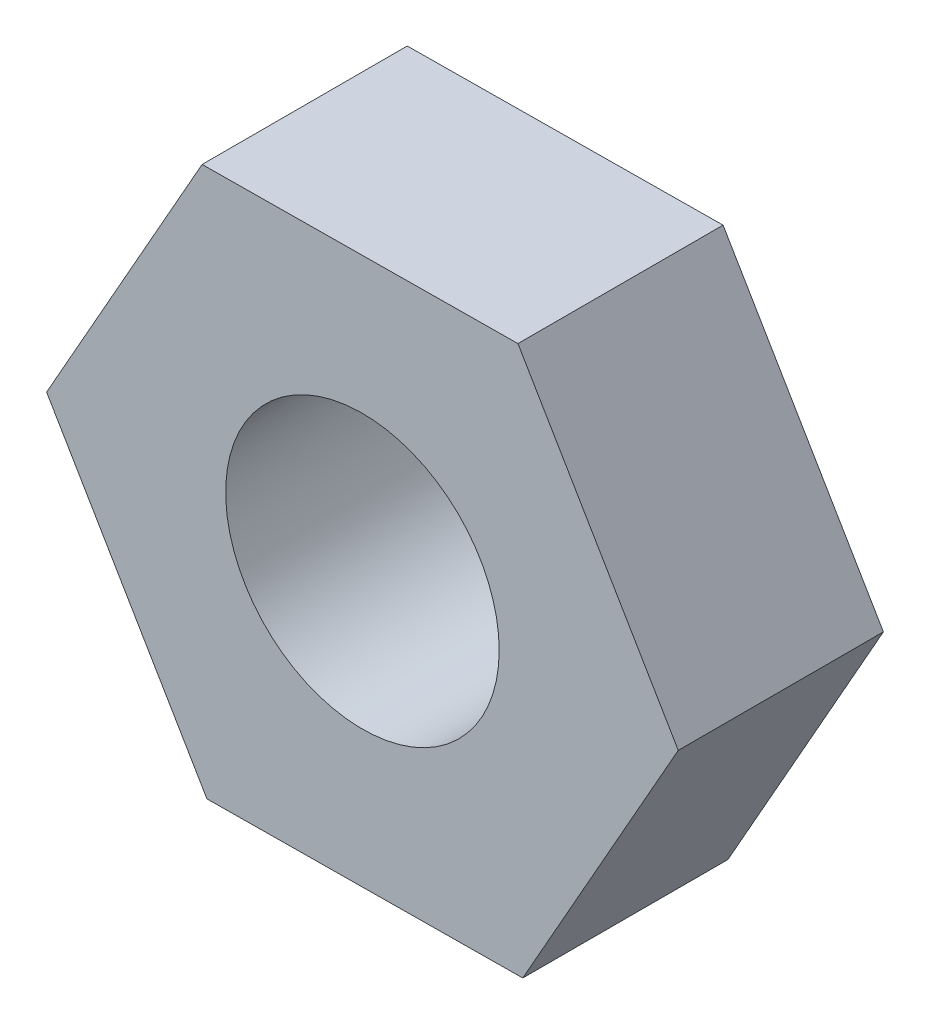
ISO-10303-21;
HEADER;
FILE_DESCRIPTION(('STEP AP214'),'2;1');
FILE_NAME('part.step','',(''),(''),'','','');
FILE_SCHEMA(('AUTOMOTIVE_DESIGN { 1 0 10303 214 1 1 1 1 }'));
ENDSEC;
DATA;
#1=APPLICATION_CONTEXT('core data for automotive mechanical design processes');
#2=APPLICATION_PROTOCOL_DEFINITION('international standard','automotive_design',2000,#1);
#3=PRODUCT_CONTEXT('',#1,'mechanical');
#4=PRODUCT('Part','Part','',(#3));
#5=PRODUCT_RELATED_PRODUCT_CATEGORY('part','',(#4));
#6=PRODUCT_DEFINITION_FORMATION('','',#4);
#7=PRODUCT_DEFINITION_CONTEXT('part definition',#1,'design');
#8=PRODUCT_DEFINITION('design','',#6,#7);
#9=PRODUCT_DEFINITION_SHAPE('','',#8);
#10=(LENGTH_UNIT() NAMED_UNIT(*) SI_UNIT(.MILLI.,.METRE.));
#11=(NAMED_UNIT(*) PLANE_ANGLE_UNIT() SI_UNIT($,.RADIAN.));
#12=(NAMED_UNIT(*) SI_UNIT($,.STERADIAN.) SOLID_ANGLE_UNIT());
#13=UNCERTAINTY_MEASURE_WITH_UNIT(LENGTH_MEASURE(1.E-05),#10,'distance_accuracy_value','');
#14=(GEOMETRIC_REPRESENTATION_CONTEXT(3) GLOBAL_UNCERTAINTY_ASSIGNED_CONTEXT((#13)) GLOBAL_UNIT_ASSIGNED_CONTEXT((#10,
#11,#12)) REPRESENTATION_CONTEXT('',''));
#15=CARTESIAN_POINT('',(0.,0.,0.));
#16=DIRECTION('',(0.,0.,1.));
#17=DIRECTION('',(1.,0.,0.));
#18=AXIS2_PLACEMENT_3D('',#15,#16,#17);
#19=CARTESIAN_POINT('',(0.,0.,1.5));
#20=DIRECTION('',(0.,0.,1.));
#21=DIRECTION('',(1.,0.,0.));
#22=AXIS2_PLACEMENT_3D('',#19,#20,#21);
#23=PLANE('',#22);
#24=DIRECTION('',(0.999961257640527,0.00880245522430745,0.));
#25=VECTOR('',#24,1.);
#26=CARTESIAN_POINT('',(-1.13705089210729,-2.01008671506762,1.5));
#27=LINE('',#26,#25);
#28=CARTESIAN_POINT('',(-1.13705089210729,-2.01008671506762,1.5));
#29=VERTEX_POINT('',#28);
#30=CARTESIAN_POINT('',(1.17226071300452,-1.98975831549449,1.5));
#31=VERTEX_POINT('',#30);
#32=EDGE_CURVE('E146',#29,#31,#27,.T.);
#33=ORIENTED_EDGE('',*,*,#32,.T.);
#34=DIRECTION('',(0.492357478980338,0.870393079529086,0.));
#35=VECTOR('',#34,1.);
#36=CARTESIAN_POINT('',(1.17226071300452,-1.98975831549449,1.5));
#37=LINE('',#36,#35);
#38=CARTESIAN_POINT('',(2.30931160511182,0.0203283995731343,1.5));
#39=VERTEX_POINT('',#38);
#40=EDGE_CURVE('E94',#31,#39,#37,.T.);
#41=ORIENTED_EDGE('',*,*,#40,.T.);
#42=DIRECTION('',(-0.507603778660189,0.861590624304779,0.));
#43=VECTOR('',#42,1.);
#44=CARTESIAN_POINT('',(2.30931160511182,0.0203283995731343,1.5));
#45=LINE('',#44,#43);
#46=CARTESIAN_POINT('',(1.13705089210729,2.01008671506762,1.5));
#47=VERTEX_POINT('',#46);
#48=EDGE_CURVE('E107',#39,#47,#45,.T.);
#49=ORIENTED_EDGE('',*,*,#48,.T.);
#50=DIRECTION('',(-0.999961257640527,-0.00880245522430745,0.));
#51=VECTOR('',#50,1.);
#52=CARTESIAN_POINT('',(1.13705089210729,2.01008671506762,1.5));
#53=LINE('',#52,#51);
#54=CARTESIAN_POINT('',(-1.17226071300452,1.98975831549449,1.5));
#55=VERTEX_POINT('',#54);
#56=EDGE_CURVE('E101',#47,#55,#53,.T.);
#57=ORIENTED_EDGE('',*,*,#56,.T.);
#58=DIRECTION('',(-0.492357478980338,-0.870393079529086,0.));
#59=VECTOR('',#58,1.);
#60=CARTESIAN_POINT('',(-1.17226071300452,1.98975831549449,1.5));
#61=LINE('',#60,#59);
#62=CARTESIAN_POINT('',(-2.30931160511182,-0.0203283995731342,1.5));
#63=VERTEX_POINT('',#62);
#64=EDGE_CURVE('E105',#55,#63,#61,.T.);
#65=ORIENTED_EDGE('',*,*,#64,.T.);
#66=DIRECTION('',(0.507603778660189,-0.861590624304779,0.));
#67=VECTOR('',#66,1.);
#68=CARTESIAN_POINT('',(-2.30931160511182,-0.0203283995731342,1.5));
#69=LINE('',#68,#67);
#70=EDGE_CURVE('E57',#63,#29,#69,.T.);
#71=ORIENTED_EDGE('',*,*,#70,.T.);
#72=EDGE_LOOP('',(#33,#41,#49,#57,#65,#71));
#73=FACE_BOUND('',#72,.T.);
#74=CARTESIAN_POINT('',(0.,0.,1.5));
#75=DIRECTION('',(0.,0.,1.));
#76=DIRECTION('',(1.,0.,0.));
#77=AXIS2_PLACEMENT_3D('',#74,#75,#76);
#78=CIRCLE('',#77,1.);
#79=CARTESIAN_POINT('',(1.,0.,1.5));
#80=VERTEX_POINT('',#79);
#81=EDGE_CURVE('E134',#80,#80,#78,.T.);
#82=ORIENTED_EDGE('',*,*,#81,.F.);
#83=EDGE_LOOP('',(#82));
#84=FACE_BOUND('',#83,.T.);
#85=ADVANCED_FACE('F39',(#73,#84),#23,.T.);
#86=CARTESIAN_POINT('',(0.,0.,0.));
#87=DIRECTION('',(0.,0.,1.));
#88=DIRECTION('',(1.,0.,0.));
#89=AXIS2_PLACEMENT_3D('',#86,#87,#88);
#90=PLANE('',#89);
#91=DIRECTION('',(0.999961257640527,0.00880245522430745,0.));
#92=VECTOR('',#91,1.);
#93=CARTESIAN_POINT('',(-1.13705089210729,-2.01008671506762,0.));
#94=LINE('',#93,#92);
#95=CARTESIAN_POINT('',(-1.13705089210729,-2.01008671506762,0.));
#96=VERTEX_POINT('',#95);
#97=CARTESIAN_POINT('',(1.17226071300452,-1.98975831549449,0.));
#98=VERTEX_POINT('',#97);
#99=EDGE_CURVE('E129',#96,#98,#94,.T.);
#100=ORIENTED_EDGE('',*,*,#99,.F.);
#101=DIRECTION('',(0.507603778660189,-0.861590624304779,0.));
#102=VECTOR('',#101,1.);
#103=CARTESIAN_POINT('',(-2.30931160511182,-0.0203283995731342,0.));
#104=LINE('',#103,#102);
#105=CARTESIAN_POINT('',(-2.30931160511182,-0.0203283995731342,0.));
#106=VERTEX_POINT('',#105);
#107=EDGE_CURVE('E86',#106,#96,#104,.T.);
#108=ORIENTED_EDGE('',*,*,#107,.F.);
#109=DIRECTION('',(-0.492357478980338,-0.870393079529086,0.));
#110=VECTOR('',#109,1.);
#111=CARTESIAN_POINT('',(-1.17226071300452,1.98975831549449,0.));
#112=LINE('',#111,#110);
#113=CARTESIAN_POINT('',(-1.17226071300452,1.98975831549449,0.));
#114=VERTEX_POINT('',#113);
#115=EDGE_CURVE('E80',#114,#106,#112,.T.);
#116=ORIENTED_EDGE('',*,*,#115,.F.);
#117=DIRECTION('',(-0.999961257640527,-0.00880245522430745,0.));
#118=VECTOR('',#117,1.);
#119=CARTESIAN_POINT('',(1.13705089210729,2.01008671506762,0.));
#120=LINE('',#119,#118);
#121=CARTESIAN_POINT('',(1.13705089210729,2.01008671506762,0.));
#122=VERTEX_POINT('',#121);
#123=EDGE_CURVE('E116',#122,#114,#120,.T.);
#124=ORIENTED_EDGE('',*,*,#123,.F.);
#125=DIRECTION('',(-0.507603778660189,0.861590624304779,0.));
#126=VECTOR('',#125,1.);
#127=CARTESIAN_POINT('',(2.30931160511182,0.0203283995731343,0.));
#128=LINE('',#127,#126);
#129=CARTESIAN_POINT('',(2.30931160511182,0.0203283995731343,0.));
#130=VERTEX_POINT('',#129);
#131=EDGE_CURVE('E137',#130,#122,#128,.T.);
#132=ORIENTED_EDGE('',*,*,#131,.F.);
#133=DIRECTION('',(0.492357478980338,0.870393079529086,0.));
#134=VECTOR('',#133,1.);
#135=CARTESIAN_POINT('',(1.17226071300452,-1.98975831549449,0.));
#136=LINE('',#135,#134);
#137=EDGE_CURVE('E133',#98,#130,#136,.T.);
#138=ORIENTED_EDGE('',*,*,#137,.F.);
#139=EDGE_LOOP('',(#100,#108,#116,#124,#132,#138));
#140=FACE_BOUND('',#139,.T.);
#141=CARTESIAN_POINT('',(0.,0.,0.));
#142=DIRECTION('',(0.,0.,1.));
#143=DIRECTION('',(1.,0.,0.));
#144=AXIS2_PLACEMENT_3D('',#141,#142,#143);
#145=CIRCLE('',#144,1.);
#146=CARTESIAN_POINT('',(1.,0.,0.));
#147=VERTEX_POINT('',#146);
#148=EDGE_CURVE('E243',#147,#147,#145,.T.);
#149=ORIENTED_EDGE('',*,*,#148,.T.);
#150=EDGE_LOOP('',(#149));
#151=FACE_BOUND('',#150,.T.);
#152=ADVANCED_FACE('F159',(#140,#151),#90,.F.);
#153=CARTESIAN_POINT('',(-1.13705089210729,-2.01008671506762,1.5));
#154=DIRECTION('',(-0.00880245522430745,0.999961257640527,0.));
#155=DIRECTION('',(-0.999961257640527,-0.00880245522430745,0.));
#156=AXIS2_PLACEMENT_3D('',#153,#154,#155);
#157=PLANE('',#156);
#158=ORIENTED_EDGE('',*,*,#99,.T.);
#159=DIRECTION('',(0.,0.,-1.));
#160=VECTOR('',#159,1.);
#161=CARTESIAN_POINT('',(1.17226071300452,-1.98975831549449,1.5));
#162=LINE('',#161,#160);
#163=EDGE_CURVE('E11',#31,#98,#162,.T.);
#164=ORIENTED_EDGE('',*,*,#163,.F.);
#165=ORIENTED_EDGE('',*,*,#32,.F.);
#166=DIRECTION('',(0.,0.,-1.));
#167=VECTOR('',#166,1.);
#168=CARTESIAN_POINT('',(-1.13705089210729,-2.01008671506762,1.5));
#169=LINE('',#168,#167);
#170=EDGE_CURVE('E125',#29,#96,#169,.T.);
#171=ORIENTED_EDGE('',*,*,#170,.T.);
#172=EDGE_LOOP('',(#158,#164,#165,#171));
#173=FACE_BOUND('',#172,.T.);
#174=ADVANCED_FACE('F41',(#173),#157,.F.);
#175=CARTESIAN_POINT('',(1.17226071300452,-1.98975831549449,1.5));
#176=DIRECTION('',(-0.870393079529086,0.492357478980338,0.));
#177=DIRECTION('',(-0.492357478980338,-0.870393079529086,0.));
#178=AXIS2_PLACEMENT_3D('',#175,#176,#177);
#179=PLANE('',#178);
#180=ORIENTED_EDGE('',*,*,#137,.T.);
#181=DIRECTION('',(0.,0.,-1.));
#182=VECTOR('',#181,1.);
#183=CARTESIAN_POINT('',(2.30931160511182,0.0203283995731343,1.5));
#184=LINE('',#183,#182);
#185=EDGE_CURVE('E49',#39,#130,#184,.T.);
#186=ORIENTED_EDGE('',*,*,#185,.F.);
#187=ORIENTED_EDGE('',*,*,#40,.F.);
#188=ORIENTED_EDGE('',*,*,#163,.T.);
#189=EDGE_LOOP('',(#180,#186,#187,#188));
#190=FACE_BOUND('',#189,.T.);
#191=ADVANCED_FACE('F184',(#190),#179,.F.);
#192=CARTESIAN_POINT('',(2.30931160511182,0.0203283995731343,1.5));
#193=DIRECTION('',(-0.861590624304779,-0.507603778660189,0.));
#194=DIRECTION('',(0.507603778660189,-0.861590624304779,0.));
#195=AXIS2_PLACEMENT_3D('',#192,#193,#194);
#196=PLANE('',#195);
#197=ORIENTED_EDGE('',*,*,#131,.T.);
#198=DIRECTION('',(0.,0.,-1.));
#199=VECTOR('',#198,1.);
#200=CARTESIAN_POINT('',(1.13705089210729,2.01008671506762,1.5));
#201=LINE('',#200,#199);
#202=EDGE_CURVE('E118',#47,#122,#201,.T.);
#203=ORIENTED_EDGE('',*,*,#202,.F.);
#204=ORIENTED_EDGE('',*,*,#48,.F.);
#205=ORIENTED_EDGE('',*,*,#185,.T.);
#206=EDGE_LOOP('',(#197,#203,#204,#205));
#207=FACE_BOUND('',#206,.T.);
#208=ADVANCED_FACE('F156',(#207),#196,.F.);
#209=CARTESIAN_POINT('',(1.13705089210729,2.01008671506762,1.5));
#210=DIRECTION('',(0.00880245522430745,-0.999961257640527,0.));
#211=DIRECTION('',(0.999961257640527,0.00880245522430745,0.));
#212=AXIS2_PLACEMENT_3D('',#209,#210,#211);
#213=PLANE('',#212);
#214=ORIENTED_EDGE('',*,*,#123,.T.);
#215=DIRECTION('',(0.,0.,-1.));
#216=VECTOR('',#215,1.);
#217=CARTESIAN_POINT('',(-1.17226071300452,1.98975831549449,1.5));
#218=LINE('',#217,#216);
#219=EDGE_CURVE('E113',#55,#114,#218,.T.);
#220=ORIENTED_EDGE('',*,*,#219,.F.);
#221=ORIENTED_EDGE('',*,*,#56,.F.);
#222=ORIENTED_EDGE('',*,*,#202,.T.);
#223=EDGE_LOOP('',(#214,#220,#221,#222));
#224=FACE_BOUND('',#223,.T.);
#225=ADVANCED_FACE('F114',(#224),#213,.F.);
#226=CARTESIAN_POINT('',(-1.17226071300452,1.98975831549449,1.5));
#227=DIRECTION('',(0.870393079529086,-0.492357478980338,0.));
#228=DIRECTION('',(0.492357478980338,0.870393079529086,0.));
#229=AXIS2_PLACEMENT_3D('',#226,#227,#228);
#230=PLANE('',#229);
#231=ORIENTED_EDGE('',*,*,#115,.T.);
#232=DIRECTION('',(0.,0.,-1.));
#233=VECTOR('',#232,1.);
#234=CARTESIAN_POINT('',(-2.30931160511182,-0.0203283995731342,1.5));
#235=LINE('',#234,#233);
#236=EDGE_CURVE('E119',#63,#106,#235,.T.);
#237=ORIENTED_EDGE('',*,*,#236,.F.);
#238=ORIENTED_EDGE('',*,*,#64,.F.);
#239=ORIENTED_EDGE('',*,*,#219,.T.);
#240=EDGE_LOOP('',(#231,#237,#238,#239));
#241=FACE_BOUND('',#240,.T.);
#242=ADVANCED_FACE('F121',(#241),#230,.F.);
#243=CARTESIAN_POINT('',(-2.30931160511182,-0.0203283995731342,1.5));
#244=DIRECTION('',(0.861590624304778,0.507603778660189,0.));
#245=DIRECTION('',(-0.507603778660189,0.861590624304779,0.));
#246=AXIS2_PLACEMENT_3D('',#243,#244,#245);
#247=PLANE('',#246);
#248=ORIENTED_EDGE('',*,*,#107,.T.);
#249=ORIENTED_EDGE('',*,*,#170,.F.);
#250=ORIENTED_EDGE('',*,*,#70,.F.);
#251=ORIENTED_EDGE('',*,*,#236,.T.);
#252=EDGE_LOOP('',(#248,#249,#250,#251));
#253=FACE_BOUND('',#252,.T.);
#254=ADVANCED_FACE('F164',(#253),#247,.F.);
#255=CARTESIAN_POINT('',(0.,0.,1.5));
#256=DIRECTION('',(0.,0.,-1.));
#257=DIRECTION('',(-1.,0.,0.));
#258=AXIS2_PLACEMENT_3D('',#255,#256,#257);
#259=CYLINDRICAL_SURFACE('',#258,1.);
#260=ORIENTED_EDGE('',*,*,#81,.T.);
#261=EDGE_LOOP('',(#260));
#262=FACE_BOUND('',#261,.T.);
#263=ORIENTED_EDGE('',*,*,#148,.F.);
#264=EDGE_LOOP('',(#263));
#265=FACE_BOUND('',#264,.T.);
#266=ADVANCED_FACE('F166',(#262,#265),#259,.F.);
#267=CLOSED_SHELL('',(#85,#152,#174,#191,#208,#225,#242,#254,#266));
#268=MANIFOLD_SOLID_BREP('B2',#267);
#269=ADVANCED_BREP_SHAPE_REPRESENTATION('',(#18,#268),#14);
#270=SHAPE_DEFINITION_REPRESENTATION(#9,#269);
ENDSEC;
END-ISO-10303-21;
